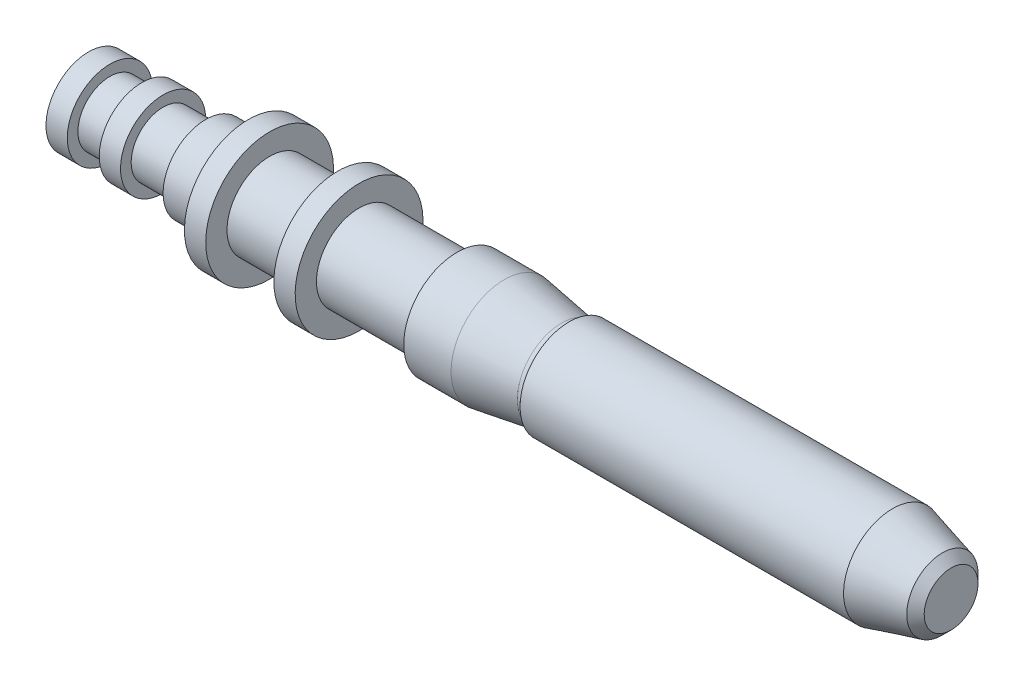
ISO-10303-21;
HEADER;
FILE_DESCRIPTION(('STEP AP214'),'2;1');
FILE_NAME('part.step','',(''),(''),'','','');
FILE_SCHEMA(('AUTOMOTIVE_DESIGN { 1 0 10303 214 1 1 1 1 }'));
ENDSEC;
DATA;
#1=APPLICATION_CONTEXT('core data for automotive mechanical design processes');
#2=APPLICATION_PROTOCOL_DEFINITION('international standard','automotive_design',2000,#1);
#3=PRODUCT_CONTEXT('',#1,'mechanical');
#4=PRODUCT('Part','Part','',(#3));
#5=PRODUCT_RELATED_PRODUCT_CATEGORY('part','',(#4));
#6=PRODUCT_DEFINITION_FORMATION('','',#4);
#7=PRODUCT_DEFINITION_CONTEXT('part definition',#1,'design');
#8=PRODUCT_DEFINITION('design','',#6,#7);
#9=PRODUCT_DEFINITION_SHAPE('','',#8);
#10=(LENGTH_UNIT() NAMED_UNIT(*) SI_UNIT(.MILLI.,.METRE.));
#11=(NAMED_UNIT(*) PLANE_ANGLE_UNIT() SI_UNIT($,.RADIAN.));
#12=(NAMED_UNIT(*) SI_UNIT($,.STERADIAN.) SOLID_ANGLE_UNIT());
#13=UNCERTAINTY_MEASURE_WITH_UNIT(LENGTH_MEASURE(1.E-05),#10,'distance_accuracy_value','');
#14=(GEOMETRIC_REPRESENTATION_CONTEXT(3) GLOBAL_UNCERTAINTY_ASSIGNED_CONTEXT((#13)) GLOBAL_UNIT_ASSIGNED_CONTEXT((#10,
#11,#12)) REPRESENTATION_CONTEXT('',''));
#15=CARTESIAN_POINT('',(0.,0.,0.));
#16=DIRECTION('',(0.,0.,1.));
#17=DIRECTION('',(1.,0.,0.));
#18=AXIS2_PLACEMENT_3D('',#15,#16,#17);
#19=CARTESIAN_POINT('',(17.2428350367779,0.397037489060815,0.));
#20=DIRECTION('',(-1.,0.,0.));
#21=DIRECTION('',(0.,-1.,0.));
#22=AXIS2_PLACEMENT_3D('',#19,#20,#21);
#23=PLANE('',#22);
#24=CARTESIAN_POINT('',(17.2428350367779,2.4742729517013E-13,0.));
#25=DIRECTION('',(-1.,0.,0.));
#26=DIRECTION('',(0.,-1.,0.));
#27=AXIS2_PLACEMENT_3D('',#24,#25,#26);
#28=CIRCLE('',#27,0.320837489060457);
#29=CARTESIAN_POINT('',(17.2428350367779,-0.320837489060209,0.));
#30=VERTEX_POINT('',#29);
#31=EDGE_CURVE('E10',#30,#30,#28,.F.);
#32=ORIENTED_EDGE('',*,*,#31,.T.);
#33=EDGE_LOOP('',(#32));
#34=FACE_BOUND('',#33,.T.);
#35=ADVANCED_FACE('F42',(#34),#23,.F.);
#36=CARTESIAN_POINT('',(17.2428350367778,2.4742729517013E-13,0.));
#37=DIRECTION('',(-1.,0.,0.));
#38=DIRECTION('',(0.,-1.,0.));
#39=AXIS2_PLACEMENT_3D('',#36,#37,#38);
#40=CONICAL_SURFACE('',#39,0.397037489060568,0.261799387799174);
#41=CARTESIAN_POINT('',(17.1387439010094,2.47401800194882E-13,0.));
#42=DIRECTION('',(1.,0.,0.));
#43=DIRECTION('',(0.,1.,0.));
#44=AXIS2_PLACEMENT_3D('',#41,#42,#43);
#45=CIRCLE('',#44,0.424928624828946);
#46=CARTESIAN_POINT('',(17.1387439010094,0.424928624829193,0.));
#47=VERTEX_POINT('',#46);
#48=EDGE_CURVE('E50',#47,#47,#45,.F.);
#49=ORIENTED_EDGE('',*,*,#48,.T.);
#50=EDGE_LOOP('',(#49));
#51=FACE_BOUND('',#50,.T.);
#52=CARTESIAN_POINT('',(16.5443350367779,2.47256212012289E-13,0.));
#53=DIRECTION('',(-1.,0.,0.));
#54=DIRECTION('',(0.,-1.,0.));
#55=AXIS2_PLACEMENT_3D('',#52,#53,#54);
#56=CIRCLE('',#55,0.584199999973708);
#57=CARTESIAN_POINT('',(16.5443350367779,-0.584199999973461,0.));
#58=VERTEX_POINT('',#57);
#59=EDGE_CURVE('E68',#58,#58,#56,.T.);
#60=ORIENTED_EDGE('',*,*,#59,.F.);
#61=EDGE_LOOP('',(#60));
#62=FACE_BOUND('',#61,.T.);
#63=ADVANCED_FACE('F286',(#51,#62),#40,.T.);
#64=CARTESIAN_POINT('',(-986.284560053313,0.,0.));
#65=DIRECTION('',(-1.,0.,0.));
#66=DIRECTION('',(0.,-1.,0.));
#67=AXIS2_PLACEMENT_3D('',#64,#65,#66);
#68=CYLINDRICAL_SURFACE('',#67,0.584199999973708);
#69=CARTESIAN_POINT('',(12.6860750367779,2.46311210860433E-13,0.));
#70=DIRECTION('',(-1.,0.,0.));
#71=DIRECTION('',(0.,-1.,0.));
#72=AXIS2_PLACEMENT_3D('',#69,#70,#71);
#73=CIRCLE('',#72,0.584199999973708);
#74=CARTESIAN_POINT('',(12.6860750367779,-0.584199999973461,0.));
#75=VERTEX_POINT('',#74);
#76=EDGE_CURVE('E72',#75,#75,#73,.T.);
#77=ORIENTED_EDGE('',*,*,#76,.F.);
#78=EDGE_LOOP('',(#77));
#79=FACE_BOUND('',#78,.T.);
#80=ORIENTED_EDGE('',*,*,#59,.T.);
#81=EDGE_LOOP('',(#80));
#82=FACE_BOUND('',#81,.T.);
#83=ADVANCED_FACE('F282',(#79,#82),#68,.T.);
#84=CARTESIAN_POINT('',(12.6860750367779,2.46311210860433E-13,0.));
#85=DIRECTION('',(1.,0.,0.));
#86=DIRECTION('',(0.,1.,0.));
#87=AXIS2_PLACEMENT_3D('',#84,#85,#86);
#88=CONICAL_SURFACE('',#87,0.584199999973708,1.04719755119725);
#89=CARTESIAN_POINT('',(12.6744384661063,2.46308360722628E-13,0.));
#90=DIRECTION('',(1.,0.,0.));
#91=DIRECTION('',(0.,1.,0.));
#92=AXIS2_PLACEMENT_3D('',#89,#90,#91);
#93=CIRCLE('',#92,0.564044868344652);
#94=CARTESIAN_POINT('',(12.6744384661063,0.564044868344898,0.));
#95=VERTEX_POINT('',#94);
#96=EDGE_CURVE('E56',#95,#95,#93,.T.);
#97=ORIENTED_EDGE('',*,*,#96,.T.);
#98=EDGE_LOOP('',(#97));
#99=FACE_BOUND('',#98,.T.);
#100=ORIENTED_EDGE('',*,*,#76,.T.);
#101=EDGE_LOOP('',(#100));
#102=FACE_BOUND('',#101,.T.);
#103=ADVANCED_FACE('F276',(#99,#102),#88,.T.);
#104=CARTESIAN_POINT('',(12.6482529868007,2.46301947129945E-13,0.));
#105=DIRECTION('',(-1.,0.,0.));
#106=DIRECTION('',(0.,-1.,0.));
#107=AXIS2_PLACEMENT_3D('',#104,#105,#106);
#108=CONICAL_SURFACE('',#107,0.518690287766769,0.157082298888577);
#109=CARTESIAN_POINT('',(12.5965268234381,2.46289277873866E-13,0.));
#110=DIRECTION('',(-1.,0.,0.));
#111=DIRECTION('',(0.,-1.,0.));
#112=AXIS2_PLACEMENT_3D('',#109,#110,#111);
#113=CIRCLE('',#112,0.526883048573556);
#114=CARTESIAN_POINT('',(12.5965268234381,-0.52688304857331,0.));
#115=VERTEX_POINT('',#114);
#116=EDGE_CURVE('E62',#115,#115,#113,.T.);
#117=ORIENTED_EDGE('',*,*,#116,.T.);
#118=EDGE_LOOP('',(#117));
#119=FACE_BOUND('',#118,.T.);
#120=CARTESIAN_POINT('',(11.913915036778,2.46122086205947E-13,0.));
#121=DIRECTION('',(-1.,0.,0.));
#122=DIRECTION('',(0.,-1.,0.));
#123=AXIS2_PLACEMENT_3D('',#120,#121,#122);
#124=CIRCLE('',#123,0.635000000004673);
#125=CARTESIAN_POINT('',(11.913915036778,-0.635000000004427,0.));
#126=VERTEX_POINT('',#125);
#127=EDGE_CURVE('E76',#126,#126,#124,.T.);
#128=ORIENTED_EDGE('',*,*,#127,.F.);
#129=EDGE_LOOP('',(#128));
#130=FACE_BOUND('',#129,.T.);
#131=ADVANCED_FACE('F271',(#119,#130),#108,.T.);
#132=CARTESIAN_POINT('',(-986.284560053313,0.,0.));
#133=DIRECTION('',(-1.,0.,0.));
#134=DIRECTION('',(0.,-1.,0.));
#135=AXIS2_PLACEMENT_3D('',#132,#133,#134);
#136=CYLINDRICAL_SURFACE('',#135,0.63500000003071);
#137=CARTESIAN_POINT('',(11.3500350367779,2.45983975438527E-13,0.));
#138=DIRECTION('',(-1.,0.,0.));
#139=DIRECTION('',(0.,-1.,0.));
#140=AXIS2_PLACEMENT_3D('',#137,#138,#139);
#141=CIRCLE('',#140,0.635000000056746);
#142=CARTESIAN_POINT('',(11.3500350367779,-0.6350000000565,0.));
#143=VERTEX_POINT('',#142);
#144=EDGE_CURVE('E80',#143,#143,#141,.T.);
#145=ORIENTED_EDGE('',*,*,#144,.F.);
#146=EDGE_LOOP('',(#145));
#147=FACE_BOUND('',#146,.T.);
#148=ORIENTED_EDGE('',*,*,#127,.T.);
#149=EDGE_LOOP('',(#148));
#150=FACE_BOUND('',#149,.T.);
#151=ADVANCED_FACE('F265',(#147,#150),#136,.T.);
#152=CARTESIAN_POINT('',(11.3500350367779,0.508000000050389,0.));
#153=DIRECTION('',(1.,0.,0.));
#154=DIRECTION('',(0.,1.,0.));
#155=AXIS2_PLACEMENT_3D('',#152,#153,#154);
#156=PLANE('',#155);
#157=CARTESIAN_POINT('',(11.3500350367779,2.45983975438527E-13,0.));
#158=DIRECTION('',(-1.,0.,0.));
#159=DIRECTION('',(0.,-1.,0.));
#160=AXIS2_PLACEMENT_3D('',#157,#158,#159);
#161=CIRCLE('',#160,0.508000000050143);
#162=CARTESIAN_POINT('',(11.3500350367779,-0.508000000049897,0.));
#163=VERTEX_POINT('',#162);
#164=EDGE_CURVE('E84',#163,#163,#161,.T.);
#165=ORIENTED_EDGE('',*,*,#164,.F.);
#166=EDGE_LOOP('',(#165));
#167=FACE_BOUND('',#166,.T.);
#168=ORIENTED_EDGE('',*,*,#144,.T.);
#169=EDGE_LOOP('',(#168));
#170=FACE_BOUND('',#169,.T.);
#171=ADVANCED_FACE('F259',(#167,#170),#156,.F.);
#172=CARTESIAN_POINT('',(-986.284560053313,0.,0.));
#173=DIRECTION('',(-1.,0.,0.));
#174=DIRECTION('',(0.,-1.,0.));
#175=AXIS2_PLACEMENT_3D('',#172,#173,#174);
#176=CYLINDRICAL_SURFACE('',#175,0.508000000024987);
#177=CARTESIAN_POINT('',(10.1816350367779,2.45697799974502E-13,0.));
#178=DIRECTION('',(-1.,0.,0.));
#179=DIRECTION('',(0.,-1.,0.));
#180=AXIS2_PLACEMENT_3D('',#177,#178,#179);
#181=CIRCLE('',#180,0.507999999999831);
#182=CARTESIAN_POINT('',(10.1816350367779,-0.507999999999586,0.));
#183=VERTEX_POINT('',#182);
#184=EDGE_CURVE('E88',#183,#183,#181,.T.);
#185=ORIENTED_EDGE('',*,*,#184,.F.);
#186=EDGE_LOOP('',(#185));
#187=FACE_BOUND('',#186,.T.);
#188=ORIENTED_EDGE('',*,*,#164,.T.);
#189=EDGE_LOOP('',(#188));
#190=FACE_BOUND('',#189,.T.);
#191=ADVANCED_FACE('F253',(#187,#190),#176,.T.);
#192=CARTESIAN_POINT('',(10.1816350367779,0.508000000000077,0.));
#193=DIRECTION('',(-1.,0.,0.));
#194=DIRECTION('',(0.,-1.,0.));
#195=AXIS2_PLACEMENT_3D('',#192,#193,#194);
#196=PLANE('',#195);
#197=CARTESIAN_POINT('',(10.1816350367779,2.45697799974502E-13,0.));
#198=DIRECTION('',(-1.,0.,0.));
#199=DIRECTION('',(0.,-1.,0.));
#200=AXIS2_PLACEMENT_3D('',#197,#198,#199);
#201=CIRCLE('',#200,0.762);
#202=CARTESIAN_POINT('',(10.1816350367779,-0.761999999999755,0.));
#203=VERTEX_POINT('',#202);
#204=EDGE_CURVE('E92',#203,#203,#201,.T.);
#205=ORIENTED_EDGE('',*,*,#204,.F.);
#206=EDGE_LOOP('',(#205));
#207=FACE_BOUND('',#206,.T.);
#208=ORIENTED_EDGE('',*,*,#184,.T.);
#209=EDGE_LOOP('',(#208));
#210=FACE_BOUND('',#209,.T.);
#211=ADVANCED_FACE('F247',(#207,#210),#196,.F.);
#212=CARTESIAN_POINT('',(-986.284560053313,0.,0.));
#213=DIRECTION('',(-1.,0.,0.));
#214=DIRECTION('',(0.,-1.,0.));
#215=AXIS2_PLACEMENT_3D('',#212,#213,#214);
#216=CYLINDRICAL_SURFACE('',#215,0.762);
#217=CARTESIAN_POINT('',(9.92763503677796,2.45635587917105E-13,0.));
#218=DIRECTION('',(-1.,0.,0.));
#219=DIRECTION('',(0.,-1.,0.));
#220=AXIS2_PLACEMENT_3D('',#217,#218,#219);
#221=CIRCLE('',#220,0.762);
#222=CARTESIAN_POINT('',(9.92763503677796,-0.761999999999754,0.));
#223=VERTEX_POINT('',#222);
#224=EDGE_CURVE('E96',#223,#223,#221,.T.);
#225=ORIENTED_EDGE('',*,*,#224,.F.);
#226=EDGE_LOOP('',(#225));
#227=FACE_BOUND('',#226,.T.);
#228=ORIENTED_EDGE('',*,*,#204,.T.);
#229=EDGE_LOOP('',(#228));
#230=FACE_BOUND('',#229,.T.);
#231=ADVANCED_FACE('F241',(#227,#230),#216,.T.);
#232=CARTESIAN_POINT('',(9.92763503677793,0.508000000000077,0.));
#233=DIRECTION('',(1.,0.,0.));
#234=DIRECTION('',(0.,1.,0.));
#235=AXIS2_PLACEMENT_3D('',#232,#233,#234);
#236=PLANE('',#235);
#237=CARTESIAN_POINT('',(9.92763503677796,2.45635587917105E-13,0.));
#238=DIRECTION('',(-1.,0.,0.));
#239=DIRECTION('',(0.,-1.,0.));
#240=AXIS2_PLACEMENT_3D('',#237,#238,#239);
#241=CIRCLE('',#240,0.507999999999831);
#242=CARTESIAN_POINT('',(9.92763503677796,-0.507999999999586,0.));
#243=VERTEX_POINT('',#242);
#244=EDGE_CURVE('E100',#243,#243,#241,.T.);
#245=ORIENTED_EDGE('',*,*,#244,.F.);
#246=EDGE_LOOP('',(#245));
#247=FACE_BOUND('',#246,.T.);
#248=ORIENTED_EDGE('',*,*,#224,.T.);
#249=EDGE_LOOP('',(#248));
#250=FACE_BOUND('',#249,.T.);
#251=ADVANCED_FACE('F235',(#247,#250),#236,.F.);
#252=CARTESIAN_POINT('',(-986.284560053313,0.,0.));
#253=DIRECTION('',(-1.,0.,0.));
#254=DIRECTION('',(0.,-1.,0.));
#255=AXIS2_PLACEMENT_3D('',#252,#253,#254);
#256=CYLINDRICAL_SURFACE('',#255,0.507999999999831);
#257=CARTESIAN_POINT('',(9.1148350367779,2.45436509333436E-13,0.));
#258=DIRECTION('',(-1.,0.,0.));
#259=DIRECTION('',(0.,-1.,0.));
#260=AXIS2_PLACEMENT_3D('',#257,#258,#259);
#261=CIRCLE('',#260,0.507999999999831);
#262=CARTESIAN_POINT('',(9.1148350367779,-0.507999999999586,0.));
#263=VERTEX_POINT('',#262);
#264=EDGE_CURVE('E104',#263,#263,#261,.T.);
#265=ORIENTED_EDGE('',*,*,#264,.F.);
#266=EDGE_LOOP('',(#265));
#267=FACE_BOUND('',#266,.T.);
#268=ORIENTED_EDGE('',*,*,#244,.T.);
#269=EDGE_LOOP('',(#268));
#270=FACE_BOUND('',#269,.T.);
#271=ADVANCED_FACE('F229',(#267,#270),#256,.T.);
#272=CARTESIAN_POINT('',(9.11483503677793,0.508000000000077,0.));
#273=DIRECTION('',(-1.,0.,0.));
#274=DIRECTION('',(0.,-1.,0.));
#275=AXIS2_PLACEMENT_3D('',#272,#273,#274);
#276=PLANE('',#275);
#277=CARTESIAN_POINT('',(9.1148350367779,2.45436509333436E-13,0.));
#278=DIRECTION('',(-1.,0.,0.));
#279=DIRECTION('',(0.,-1.,0.));
#280=AXIS2_PLACEMENT_3D('',#277,#278,#279);
#281=CIRCLE('',#280,0.762);
#282=CARTESIAN_POINT('',(9.1148350367779,-0.761999999999755,0.));
#283=VERTEX_POINT('',#282);
#284=EDGE_CURVE('E108',#283,#283,#281,.T.);
#285=ORIENTED_EDGE('',*,*,#284,.F.);
#286=EDGE_LOOP('',(#285));
#287=FACE_BOUND('',#286,.T.);
#288=ORIENTED_EDGE('',*,*,#264,.T.);
#289=EDGE_LOOP('',(#288));
#290=FACE_BOUND('',#289,.T.);
#291=ADVANCED_FACE('F223',(#287,#290),#276,.F.);
#292=CARTESIAN_POINT('',(-986.284560053313,0.,0.));
#293=DIRECTION('',(-1.,0.,0.));
#294=DIRECTION('',(0.,-1.,0.));
#295=AXIS2_PLACEMENT_3D('',#292,#293,#294);
#296=CYLINDRICAL_SURFACE('',#295,0.762);
#297=CARTESIAN_POINT('',(8.86083503677792,2.45374297276039E-13,0.));
#298=DIRECTION('',(-1.,0.,0.));
#299=DIRECTION('',(0.,-1.,0.));
#300=AXIS2_PLACEMENT_3D('',#297,#298,#299);
#301=CIRCLE('',#300,0.762);
#302=CARTESIAN_POINT('',(8.86083503677792,-0.761999999999755,0.));
#303=VERTEX_POINT('',#302);
#304=EDGE_CURVE('E112',#303,#303,#301,.T.);
#305=ORIENTED_EDGE('',*,*,#304,.F.);
#306=EDGE_LOOP('',(#305));
#307=FACE_BOUND('',#306,.T.);
#308=ORIENTED_EDGE('',*,*,#284,.T.);
#309=EDGE_LOOP('',(#308));
#310=FACE_BOUND('',#309,.T.);
#311=ADVANCED_FACE('F217',(#307,#310),#296,.T.);
#312=CARTESIAN_POINT('',(8.86083503677792,0.508000000000077,0.));
#313=DIRECTION('',(1.,0.,0.));
#314=DIRECTION('',(0.,1.,0.));
#315=AXIS2_PLACEMENT_3D('',#312,#313,#314);
#316=PLANE('',#315);
#317=CARTESIAN_POINT('',(8.86083503677792,2.45374297276039E-13,0.));
#318=DIRECTION('',(-1.,0.,0.));
#319=DIRECTION('',(0.,-1.,0.));
#320=AXIS2_PLACEMENT_3D('',#317,#318,#319);
#321=CIRCLE('',#320,0.507999999999831);
#322=CARTESIAN_POINT('',(8.86083503677792,-0.507999999999586,0.));
#323=VERTEX_POINT('',#322);
#324=EDGE_CURVE('E116',#323,#323,#321,.T.);
#325=ORIENTED_EDGE('',*,*,#324,.F.);
#326=EDGE_LOOP('',(#325));
#327=FACE_BOUND('',#326,.T.);
#328=ORIENTED_EDGE('',*,*,#304,.T.);
#329=EDGE_LOOP('',(#328));
#330=FACE_BOUND('',#329,.T.);
#331=ADVANCED_FACE('F211',(#327,#330),#316,.F.);
#332=CARTESIAN_POINT('',(-986.284560053313,0.,0.));
#333=DIRECTION('',(-1.,0.,0.));
#334=DIRECTION('',(0.,-1.,0.));
#335=AXIS2_PLACEMENT_3D('',#332,#333,#334);
#336=CYLINDRICAL_SURFACE('',#335,0.507999999999831);
#337=CARTESIAN_POINT('',(8.35283503677797,2.45249873161246E-13,0.));
#338=DIRECTION('',(-1.,0.,0.));
#339=DIRECTION('',(0.,-1.,0.));
#340=AXIS2_PLACEMENT_3D('',#337,#338,#339);
#341=CIRCLE('',#340,0.507999999999831);
#342=CARTESIAN_POINT('',(8.35283503677797,-0.507999999999586,0.));
#343=VERTEX_POINT('',#342);
#344=EDGE_CURVE('E120',#343,#343,#341,.T.);
#345=ORIENTED_EDGE('',*,*,#344,.F.);
#346=EDGE_LOOP('',(#345));
#347=FACE_BOUND('',#346,.T.);
#348=ORIENTED_EDGE('',*,*,#324,.T.);
#349=EDGE_LOOP('',(#348));
#350=FACE_BOUND('',#349,.T.);
#351=ADVANCED_FACE('F205',(#347,#350),#336,.T.);
#352=CARTESIAN_POINT('',(8.35283503677793,0.381000000001043,0.));
#353=DIRECTION('',(1.,0.,0.));
#354=DIRECTION('',(0.,1.,0.));
#355=AXIS2_PLACEMENT_3D('',#352,#353,#354);
#356=PLANE('',#355);
#357=CARTESIAN_POINT('',(8.35283503677797,2.45249873161246E-13,0.));
#358=DIRECTION('',(-1.,0.,0.));
#359=DIRECTION('',(0.,-1.,0.));
#360=AXIS2_PLACEMENT_3D('',#357,#358,#359);
#361=CIRCLE('',#360,0.381000000000797);
#362=CARTESIAN_POINT('',(8.35283503677797,-0.381000000000552,0.));
#363=VERTEX_POINT('',#362);
#364=EDGE_CURVE('E124',#363,#363,#361,.T.);
#365=ORIENTED_EDGE('',*,*,#364,.F.);
#366=EDGE_LOOP('',(#365));
#367=FACE_BOUND('',#366,.T.);
#368=ORIENTED_EDGE('',*,*,#344,.T.);
#369=EDGE_LOOP('',(#368));
#370=FACE_BOUND('',#369,.T.);
#371=ADVANCED_FACE('F199',(#367,#370),#356,.F.);
#372=CARTESIAN_POINT('',(-986.284560053313,0.,0.));
#373=DIRECTION('',(-1.,0.,0.));
#374=DIRECTION('',(0.,-1.,0.));
#375=AXIS2_PLACEMENT_3D('',#372,#373,#374);
#376=CYLINDRICAL_SURFACE('',#375,0.381000000000797);
#377=CARTESIAN_POINT('',(7.84483503677791,2.45125449046452E-13,0.));
#378=DIRECTION('',(-1.,0.,0.));
#379=DIRECTION('',(0.,-1.,0.));
#380=AXIS2_PLACEMENT_3D('',#377,#378,#379);
#381=CIRCLE('',#380,0.381000000000797);
#382=CARTESIAN_POINT('',(7.84483503677791,-0.381000000000552,0.));
#383=VERTEX_POINT('',#382);
#384=EDGE_CURVE('E128',#383,#383,#381,.T.);
#385=ORIENTED_EDGE('',*,*,#384,.F.);
#386=EDGE_LOOP('',(#385));
#387=FACE_BOUND('',#386,.T.);
#388=ORIENTED_EDGE('',*,*,#364,.T.);
#389=EDGE_LOOP('',(#388));
#390=FACE_BOUND('',#389,.T.);
#391=ADVANCED_FACE('F193',(#387,#390),#376,.T.);
#392=CARTESIAN_POINT('',(7.84483503677793,0.381000000001042,0.));
#393=DIRECTION('',(-1.,0.,0.));
#394=DIRECTION('',(0.,-1.,0.));
#395=AXIS2_PLACEMENT_3D('',#392,#393,#394);
#396=PLANE('',#395);
#397=CARTESIAN_POINT('',(7.84483503677791,2.45125449046452E-13,0.));
#398=DIRECTION('',(-1.,0.,0.));
#399=DIRECTION('',(0.,-1.,0.));
#400=AXIS2_PLACEMENT_3D('',#397,#398,#399);
#401=CIRCLE('',#400,0.507999999951795);
#402=CARTESIAN_POINT('',(7.84483503677791,-0.50799999995155,0.));
#403=VERTEX_POINT('',#402);
#404=EDGE_CURVE('E132',#403,#403,#401,.T.);
#405=ORIENTED_EDGE('',*,*,#404,.F.);
#406=EDGE_LOOP('',(#405));
#407=FACE_BOUND('',#406,.T.);
#408=ORIENTED_EDGE('',*,*,#384,.T.);
#409=EDGE_LOOP('',(#408));
#410=FACE_BOUND('',#409,.T.);
#411=ADVANCED_FACE('F187',(#407,#410),#396,.F.);
#412=CARTESIAN_POINT('',(-986.284560053313,0.,0.));
#413=DIRECTION('',(-1.,0.,0.));
#414=DIRECTION('',(0.,-1.,0.));
#415=AXIS2_PLACEMENT_3D('',#412,#413,#414);
#416=CYLINDRICAL_SURFACE('',#415,0.507999999951795);
#417=CARTESIAN_POINT('',(7.59083503677793,2.45063236989056E-13,0.));
#418=DIRECTION('',(-1.,0.,0.));
#419=DIRECTION('',(0.,-1.,0.));
#420=AXIS2_PLACEMENT_3D('',#417,#418,#419);
#421=CIRCLE('',#420,0.507999999951795);
#422=CARTESIAN_POINT('',(7.59083503677793,-0.50799999995155,0.));
#423=VERTEX_POINT('',#422);
#424=EDGE_CURVE('E136',#423,#423,#421,.T.);
#425=ORIENTED_EDGE('',*,*,#424,.F.);
#426=EDGE_LOOP('',(#425));
#427=FACE_BOUND('',#426,.T.);
#428=ORIENTED_EDGE('',*,*,#404,.T.);
#429=EDGE_LOOP('',(#428));
#430=FACE_BOUND('',#429,.T.);
#431=ADVANCED_FACE('F181',(#427,#430),#416,.T.);
#432=CARTESIAN_POINT('',(7.59083503677792,0.381000000001762,0.));
#433=DIRECTION('',(1.,0.,0.));
#434=DIRECTION('',(0.,1.,0.));
#435=AXIS2_PLACEMENT_3D('',#432,#433,#434);
#436=PLANE('',#435);
#437=CARTESIAN_POINT('',(7.59083503677793,2.45063236989056E-13,0.));
#438=DIRECTION('',(-1.,0.,0.));
#439=DIRECTION('',(0.,-1.,0.));
#440=AXIS2_PLACEMENT_3D('',#437,#438,#439);
#441=CIRCLE('',#440,0.381000000001517);
#442=CARTESIAN_POINT('',(7.59083503677793,-0.381000000001272,0.));
#443=VERTEX_POINT('',#442);
#444=EDGE_CURVE('E140',#443,#443,#441,.T.);
#445=ORIENTED_EDGE('',*,*,#444,.F.);
#446=EDGE_LOOP('',(#445));
#447=FACE_BOUND('',#446,.T.);
#448=ORIENTED_EDGE('',*,*,#424,.T.);
#449=EDGE_LOOP('',(#448));
#450=FACE_BOUND('',#449,.T.);
#451=ADVANCED_FACE('F175',(#447,#450),#436,.F.);
#452=CARTESIAN_POINT('',(-986.284560053313,0.,0.));
#453=DIRECTION('',(-1.,0.,0.));
#454=DIRECTION('',(0.,-1.,0.));
#455=AXIS2_PLACEMENT_3D('',#452,#453,#454);
#456=CYLINDRICAL_SURFACE('',#455,0.381000000001517);
#457=CARTESIAN_POINT('',(7.20983503677797,2.44969918902961E-13,0.));
#458=DIRECTION('',(-1.,0.,0.));
#459=DIRECTION('',(0.,-1.,0.));
#460=AXIS2_PLACEMENT_3D('',#457,#458,#459);
#461=CIRCLE('',#460,0.381000000001517);
#462=CARTESIAN_POINT('',(7.20983503677797,-0.381000000001272,0.));
#463=VERTEX_POINT('',#462);
#464=EDGE_CURVE('E144',#463,#463,#461,.T.);
#465=ORIENTED_EDGE('',*,*,#464,.F.);
#466=EDGE_LOOP('',(#465));
#467=FACE_BOUND('',#466,.T.);
#468=ORIENTED_EDGE('',*,*,#444,.T.);
#469=EDGE_LOOP('',(#468));
#470=FACE_BOUND('',#469,.T.);
#471=ADVANCED_FACE('F169',(#467,#470),#456,.T.);
#472=CARTESIAN_POINT('',(7.20983503677793,0.381000000001762,0.));
#473=DIRECTION('',(-1.,0.,0.));
#474=DIRECTION('',(0.,-1.,0.));
#475=AXIS2_PLACEMENT_3D('',#472,#473,#474);
#476=PLANE('',#475);
#477=CARTESIAN_POINT('',(7.20983503677797,2.44969918902961E-13,0.));
#478=DIRECTION('',(-1.,0.,0.));
#479=DIRECTION('',(0.,-1.,0.));
#480=AXIS2_PLACEMENT_3D('',#477,#478,#479);
#481=CIRCLE('',#480,0.508000000001517);
#482=CARTESIAN_POINT('',(7.20983503677797,-0.508000000001272,0.));
#483=VERTEX_POINT('',#482);
#484=EDGE_CURVE('E148',#483,#483,#481,.T.);
#485=ORIENTED_EDGE('',*,*,#484,.F.);
#486=EDGE_LOOP('',(#485));
#487=FACE_BOUND('',#486,.T.);
#488=ORIENTED_EDGE('',*,*,#464,.T.);
#489=EDGE_LOOP('',(#488));
#490=FACE_BOUND('',#489,.T.);
#491=ADVANCED_FACE('F163',(#487,#490),#476,.F.);
#492=CARTESIAN_POINT('',(-986.284560053313,0.,0.));
#493=DIRECTION('',(-1.,0.,0.));
#494=DIRECTION('',(0.,-1.,0.));
#495=AXIS2_PLACEMENT_3D('',#492,#493,#494);
#496=CYLINDRICAL_SURFACE('',#495,0.508000000001517);
#497=CARTESIAN_POINT('',(6.95583503677788,2.44907706845564E-13,0.));
#498=DIRECTION('',(-1.,0.,0.));
#499=DIRECTION('',(0.,-1.,0.));
#500=AXIS2_PLACEMENT_3D('',#497,#498,#499);
#501=CIRCLE('',#500,0.508000000001517);
#502=CARTESIAN_POINT('',(6.95583503677788,-0.508000000001272,0.));
#503=VERTEX_POINT('',#502);
#504=EDGE_CURVE('E152',#503,#503,#501,.T.);
#505=ORIENTED_EDGE('',*,*,#504,.F.);
#506=EDGE_LOOP('',(#505));
#507=FACE_BOUND('',#506,.T.);
#508=ORIENTED_EDGE('',*,*,#484,.T.);
#509=EDGE_LOOP('',(#508));
#510=FACE_BOUND('',#509,.T.);
#511=ADVANCED_FACE('F160',(#507,#510),#496,.T.);
#512=CARTESIAN_POINT('',(6.95583503677793,0.508000000001761,0.));
#513=DIRECTION('',(1.,0.,0.));
#514=DIRECTION('',(0.,1.,0.));
#515=AXIS2_PLACEMENT_3D('',#512,#513,#514);
#516=PLANE('',#515);
#517=ORIENTED_EDGE('',*,*,#504,.T.);
#518=EDGE_LOOP('',(#517));
#519=FACE_BOUND('',#518,.T.);
#520=ADVANCED_FACE('F158',(#519),#516,.F.);
#521=CARTESIAN_POINT('',(12.6084473303379,2.4629219755599E-13,0.));
#522=DIRECTION('',(-1.,0.,0.));
#523=DIRECTION('',(0.,-1.,0.));
#524=AXIS2_PLACEMENT_3D('',#521,#522,#523);
#525=TOROIDAL_SURFACE('',#524,0.602144868344609,0.0762);
#526=ORIENTED_EDGE('',*,*,#96,.F.);
#527=EDGE_LOOP('',(#526));
#528=FACE_BOUND('',#527,.T.);
#529=ORIENTED_EDGE('',*,*,#116,.F.);
#530=EDGE_LOOP('',(#529));
#531=FACE_BOUND('',#530,.T.);
#532=ADVANCED_FACE('F293',(#528,#531),#525,.F.);
#533=CARTESIAN_POINT('',(17.1387439010094,2.47401800194882E-13,0.));
#534=DIRECTION('',(-1.,0.,0.));
#535=DIRECTION('',(0.,-1.,0.));
#536=AXIS2_PLACEMENT_3D('',#533,#534,#535);
#537=CONICAL_SURFACE('',#536,0.424928624828946,0.785398163397442);
#538=ORIENTED_EDGE('',*,*,#31,.F.);
#539=EDGE_LOOP('',(#538));
#540=FACE_BOUND('',#539,.T.);
#541=ORIENTED_EDGE('',*,*,#48,.F.);
#542=EDGE_LOOP('',(#541));
#543=FACE_BOUND('',#542,.T.);
#544=ADVANCED_FACE('F44',(#540,#543),#537,.T.);
#545=CLOSED_SHELL('',(#35,#63,#83,#103,#131,#151,#171,#191,#211,#231,#251,#271,#291,#311,#331,
#351,#371,#391,#411,#431,#451,#471,#491,#511,#520,#532,#544));
#546=MANIFOLD_SOLID_BREP('B2',#545);
#547=ADVANCED_BREP_SHAPE_REPRESENTATION('',(#18,#546),#14);
#548=SHAPE_DEFINITION_REPRESENTATION(#9,#547);
ENDSEC;
END-ISO-10303-21;
